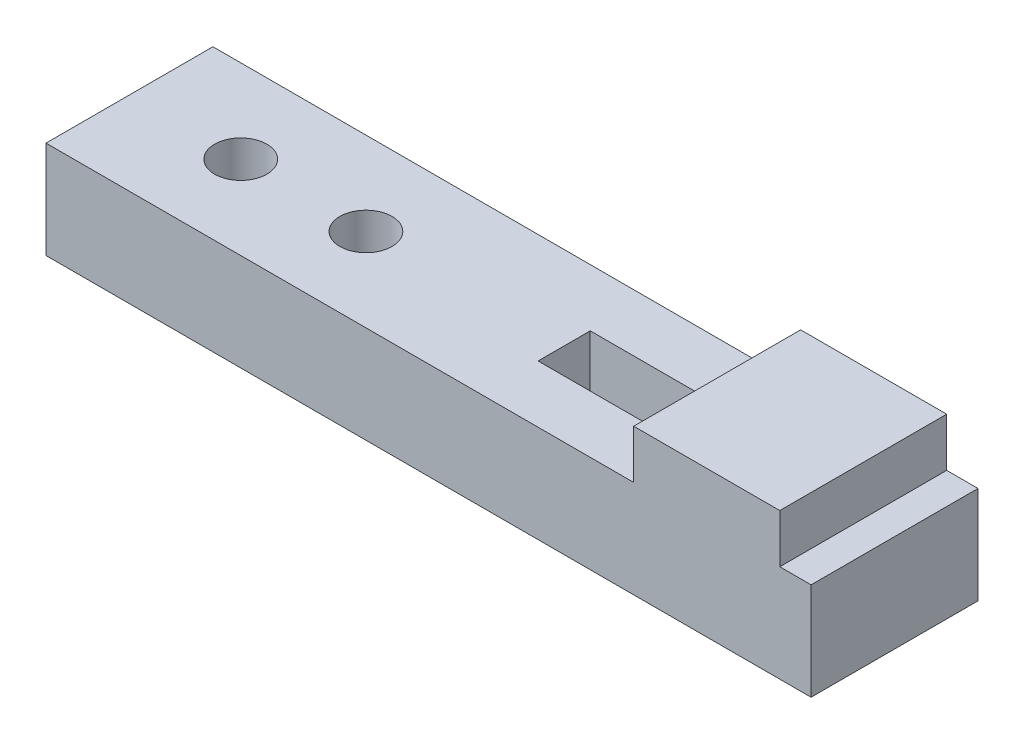
ISO-10303-21;
HEADER;
FILE_DESCRIPTION(('STEP AP214'),'2;1');
FILE_NAME('part.step','',(''),(''),'','','');
FILE_SCHEMA(('AUTOMOTIVE_DESIGN { 1 0 10303 214 1 1 1 1 }'));
ENDSEC;
DATA;
#1=APPLICATION_CONTEXT('core data for automotive mechanical design processes');
#2=APPLICATION_PROTOCOL_DEFINITION('international standard','automotive_design',2000,#1);
#3=PRODUCT_CONTEXT('',#1,'mechanical');
#4=PRODUCT('Part','Part','',(#3));
#5=PRODUCT_RELATED_PRODUCT_CATEGORY('part','',(#4));
#6=PRODUCT_DEFINITION_FORMATION('','',#4);
#7=PRODUCT_DEFINITION_CONTEXT('part definition',#1,'design');
#8=PRODUCT_DEFINITION('design','',#6,#7);
#9=PRODUCT_DEFINITION_SHAPE('','',#8);
#10=(LENGTH_UNIT() NAMED_UNIT(*) SI_UNIT(.MILLI.,.METRE.));
#11=(NAMED_UNIT(*) PLANE_ANGLE_UNIT() SI_UNIT($,.RADIAN.));
#12=(NAMED_UNIT(*) SI_UNIT($,.STERADIAN.) SOLID_ANGLE_UNIT());
#13=UNCERTAINTY_MEASURE_WITH_UNIT(LENGTH_MEASURE(1.E-05),#10,'distance_accuracy_value','');
#14=(GEOMETRIC_REPRESENTATION_CONTEXT(3) GLOBAL_UNCERTAINTY_ASSIGNED_CONTEXT((#13)) GLOBAL_UNIT_ASSIGNED_CONTEXT((#10,
#11,#12)) REPRESENTATION_CONTEXT('',''));
#15=CARTESIAN_POINT('',(0.,0.,0.));
#16=DIRECTION('',(0.,0.,1.));
#17=DIRECTION('',(1.,0.,0.));
#18=AXIS2_PLACEMENT_3D('',#15,#16,#17);
#19=CARTESIAN_POINT('',(0.,28.,0.));
#20=DIRECTION('',(0.,-1.,0.));
#21=DIRECTION('',(0.,0.,-1.));
#22=AXIS2_PLACEMENT_3D('',#19,#20,#21);
#23=PLANE('',#22);
#24=DIRECTION('',(0.,0.,-1.));
#25=VECTOR('',#24,1.);
#26=CARTESIAN_POINT('',(101.,28.,0.));
#27=LINE('',#26,#25);
#28=CARTESIAN_POINT('',(101.,28.,24.));
#29=VERTEX_POINT('',#28);
#30=CARTESIAN_POINT('',(101.,28.,-24.));
#31=VERTEX_POINT('',#30);
#32=EDGE_CURVE('E160',#29,#31,#27,.T.);
#33=ORIENTED_EDGE('',*,*,#32,.F.);
#34=DIRECTION('',(1.,0.,0.));
#35=VECTOR('',#34,1.);
#36=CARTESIAN_POINT('',(-110.,28.,24.));
#37=LINE('',#36,#35);
#38=CARTESIAN_POINT('',(110.,28.,24.));
#39=VERTEX_POINT('',#38);
#40=EDGE_CURVE('E63',#29,#39,#37,.T.);
#41=ORIENTED_EDGE('',*,*,#40,.T.);
#42=DIRECTION('',(0.,0.,-1.));
#43=VECTOR('',#42,1.);
#44=CARTESIAN_POINT('',(110.,28.,24.));
#45=LINE('',#44,#43);
#46=CARTESIAN_POINT('',(110.,28.,-24.));
#47=VERTEX_POINT('',#46);
#48=EDGE_CURVE('E204',#39,#47,#45,.T.);
#49=ORIENTED_EDGE('',*,*,#48,.T.);
#50=DIRECTION('',(-1.,0.,0.));
#51=VECTOR('',#50,1.);
#52=CARTESIAN_POINT('',(-110.,28.,-24.));
#53=LINE('',#52,#51);
#54=EDGE_CURVE('E93',#47,#31,#53,.T.);
#55=ORIENTED_EDGE('',*,*,#54,.T.);
#56=EDGE_LOOP('',(#33,#41,#49,#55));
#57=FACE_BOUND('',#56,.T.);
#58=ADVANCED_FACE('F39',(#57),#23,.F.);
#59=CARTESIAN_POINT('',(-78.,28.,0.));
#60=DIRECTION('',(0.,1.,0.));
#61=DIRECTION('',(0.,0.,1.));
#62=AXIS2_PLACEMENT_3D('',#59,#60,#61);
#63=CIRCLE('',#62,7.5);
#64=CARTESIAN_POINT('',(-78.,28.,7.5));
#65=VERTEX_POINT('',#64);
#66=EDGE_CURVE('E198',#65,#65,#63,.T.);
#67=ORIENTED_EDGE('',*,*,#66,.F.);
#68=EDGE_LOOP('',(#67));
#69=FACE_BOUND('',#68,.T.);
#70=CARTESIAN_POINT('',(-42.,28.,0.));
#71=DIRECTION('',(0.,1.,0.));
#72=DIRECTION('',(0.,0.,1.));
#73=AXIS2_PLACEMENT_3D('',#70,#71,#72);
#74=CIRCLE('',#73,7.5);
#75=CARTESIAN_POINT('',(-42.,28.,7.5));
#76=VERTEX_POINT('',#75);
#77=EDGE_CURVE('E192',#76,#76,#74,.T.);
#78=ORIENTED_EDGE('',*,*,#77,.F.);
#79=EDGE_LOOP('',(#78));
#80=FACE_BOUND('',#79,.T.);
#81=DIRECTION('',(0.,0.,1.));
#82=VECTOR('',#81,1.);
#83=CARTESIAN_POINT('',(59.,28.,0.));
#84=LINE('',#83,#82);
#85=CARTESIAN_POINT('',(59.,28.,-24.));
#86=VERTEX_POINT('',#85);
#87=CARTESIAN_POINT('',(59.,28.,-7.5));
#88=VERTEX_POINT('',#87);
#89=EDGE_CURVE('E165',#86,#88,#84,.T.);
#90=ORIENTED_EDGE('',*,*,#89,.F.);
#91=CARTESIAN_POINT('',(-110.,28.,-24.));
#92=VERTEX_POINT('',#91);
#93=EDGE_CURVE('E206',#86,#92,#53,.T.);
#94=ORIENTED_EDGE('',*,*,#93,.T.);
#95=DIRECTION('',(0.,0.,1.));
#96=VECTOR('',#95,1.);
#97=CARTESIAN_POINT('',(-110.,28.,24.));
#98=LINE('',#97,#96);
#99=CARTESIAN_POINT('',(-110.,28.,24.));
#100=VERTEX_POINT('',#99);
#101=EDGE_CURVE('E208',#92,#100,#98,.T.);
#102=ORIENTED_EDGE('',*,*,#101,.T.);
#103=CARTESIAN_POINT('',(59.,28.,24.));
#104=VERTEX_POINT('',#103);
#105=EDGE_CURVE('E210',#100,#104,#37,.T.);
#106=ORIENTED_EDGE('',*,*,#105,.T.);
#107=CARTESIAN_POINT('',(59.,28.,7.5));
#108=VERTEX_POINT('',#107);
#109=EDGE_CURVE('E161',#108,#104,#84,.T.);
#110=ORIENTED_EDGE('',*,*,#109,.F.);
#111=DIRECTION('',(1.,0.,0.));
#112=VECTOR('',#111,1.);
#113=CARTESIAN_POINT('',(15.,28.,7.5));
#114=LINE('',#113,#112);
#115=CARTESIAN_POINT('',(15.,28.,7.5));
#116=VERTEX_POINT('',#115);
#117=EDGE_CURVE('E179',#116,#108,#114,.T.);
#118=ORIENTED_EDGE('',*,*,#117,.F.);
#119=DIRECTION('',(0.,0.,1.));
#120=VECTOR('',#119,1.);
#121=CARTESIAN_POINT('',(15.,28.,7.5));
#122=LINE('',#121,#120);
#123=CARTESIAN_POINT('',(15.,28.,-7.5));
#124=VERTEX_POINT('',#123);
#125=EDGE_CURVE('E176',#124,#116,#122,.T.);
#126=ORIENTED_EDGE('',*,*,#125,.F.);
#127=DIRECTION('',(-1.,0.,0.));
#128=VECTOR('',#127,1.);
#129=CARTESIAN_POINT('',(15.,28.,-7.5));
#130=LINE('',#129,#128);
#131=EDGE_CURVE('E174',#88,#124,#130,.T.);
#132=ORIENTED_EDGE('',*,*,#131,.F.);
#133=EDGE_LOOP('',(#90,#94,#102,#106,#110,#118,#126,#132));
#134=FACE_BOUND('',#133,.T.);
#135=ADVANCED_FACE('F246',(#69,#80,#134),#23,.F.);
#136=CARTESIAN_POINT('',(15.,28.,-7.5));
#137=DIRECTION('',(0.,0.,1.));
#138=DIRECTION('',(1.,0.,0.));
#139=AXIS2_PLACEMENT_3D('',#136,#137,#138);
#140=PLANE('',#139);
#141=DIRECTION('',(-1.,0.,0.));
#142=VECTOR('',#141,1.);
#143=CARTESIAN_POINT('',(15.,0.,-7.5));
#144=LINE('',#143,#142);
#145=CARTESIAN_POINT('',(59.,0.,-7.5));
#146=VERTEX_POINT('',#145);
#147=CARTESIAN_POINT('',(15.,0.,-7.5));
#148=VERTEX_POINT('',#147);
#149=EDGE_CURVE('E173',#146,#148,#144,.T.);
#150=ORIENTED_EDGE('',*,*,#149,.F.);
#151=DIRECTION('',(0.,1.,0.));
#152=VECTOR('',#151,1.);
#153=CARTESIAN_POINT('',(59.,28.,-7.5));
#154=LINE('',#153,#152);
#155=EDGE_CURVE('E163',#146,#88,#154,.T.);
#156=ORIENTED_EDGE('',*,*,#155,.T.);
#157=ORIENTED_EDGE('',*,*,#131,.T.);
#158=DIRECTION('',(0.,-1.,0.));
#159=VECTOR('',#158,1.);
#160=CARTESIAN_POINT('',(15.,28.,-7.5));
#161=LINE('',#160,#159);
#162=EDGE_CURVE('E188',#124,#148,#161,.T.);
#163=ORIENTED_EDGE('',*,*,#162,.T.);
#164=EDGE_LOOP('',(#150,#156,#157,#163));
#165=FACE_BOUND('',#164,.T.);
#166=ADVANCED_FACE('F255',(#165),#140,.T.);
#167=CARTESIAN_POINT('',(15.,28.,7.5));
#168=DIRECTION('',(0.,0.,-1.));
#169=DIRECTION('',(-1.,0.,0.));
#170=AXIS2_PLACEMENT_3D('',#167,#168,#169);
#171=PLANE('',#170);
#172=ORIENTED_EDGE('',*,*,#117,.T.);
#173=DIRECTION('',(0.,-1.,0.));
#174=VECTOR('',#173,1.);
#175=CARTESIAN_POINT('',(59.,28.,7.5));
#176=LINE('',#175,#174);
#177=CARTESIAN_POINT('',(59.,0.,7.5));
#178=VERTEX_POINT('',#177);
#179=EDGE_CURVE('E11',#108,#178,#176,.T.);
#180=ORIENTED_EDGE('',*,*,#179,.T.);
#181=DIRECTION('',(1.,0.,0.));
#182=VECTOR('',#181,1.);
#183=CARTESIAN_POINT('',(15.,0.,7.5));
#184=LINE('',#183,#182);
#185=CARTESIAN_POINT('',(15.,0.,7.5));
#186=VERTEX_POINT('',#185);
#187=EDGE_CURVE('E177',#186,#178,#184,.T.);
#188=ORIENTED_EDGE('',*,*,#187,.F.);
#189=DIRECTION('',(0.,-1.,0.));
#190=VECTOR('',#189,1.);
#191=CARTESIAN_POINT('',(15.,28.,7.5));
#192=LINE('',#191,#190);
#193=EDGE_CURVE('E54',#116,#186,#192,.T.);
#194=ORIENTED_EDGE('',*,*,#193,.F.);
#195=EDGE_LOOP('',(#172,#180,#188,#194));
#196=FACE_BOUND('',#195,.T.);
#197=ADVANCED_FACE('F276',(#196),#171,.T.);
#198=CARTESIAN_POINT('',(0.,0.,0.));
#199=DIRECTION('',(0.,-1.,0.));
#200=DIRECTION('',(0.,0.,-1.));
#201=AXIS2_PLACEMENT_3D('',#198,#199,#200);
#202=PLANE('',#201);
#203=DIRECTION('',(0.,0.,1.));
#204=VECTOR('',#203,1.);
#205=CARTESIAN_POINT('',(59.,0.,24.));
#206=LINE('',#205,#204);
#207=EDGE_CURVE('E157',#146,#178,#206,.T.);
#208=ORIENTED_EDGE('',*,*,#207,.F.);
#209=ORIENTED_EDGE('',*,*,#149,.T.);
#210=DIRECTION('',(0.,0.,1.));
#211=VECTOR('',#210,1.);
#212=CARTESIAN_POINT('',(15.,0.,7.5));
#213=LINE('',#212,#211);
#214=EDGE_CURVE('E182',#148,#186,#213,.T.);
#215=ORIENTED_EDGE('',*,*,#214,.T.);
#216=ORIENTED_EDGE('',*,*,#187,.T.);
#217=EDGE_LOOP('',(#208,#209,#215,#216));
#218=FACE_BOUND('',#217,.T.);
#219=DIRECTION('',(0.,0.,1.));
#220=VECTOR('',#219,1.);
#221=CARTESIAN_POINT('',(-110.,0.,24.));
#222=LINE('',#221,#220);
#223=CARTESIAN_POINT('',(-110.,0.,-24.));
#224=VERTEX_POINT('',#223);
#225=CARTESIAN_POINT('',(-110.,0.,24.));
#226=VERTEX_POINT('',#225);
#227=EDGE_CURVE('E218',#224,#226,#222,.T.);
#228=ORIENTED_EDGE('',*,*,#227,.F.);
#229=DIRECTION('',(-1.,0.,0.));
#230=VECTOR('',#229,1.);
#231=CARTESIAN_POINT('',(-110.,0.,-24.));
#232=LINE('',#231,#230);
#233=CARTESIAN_POINT('',(110.,0.,-24.));
#234=VERTEX_POINT('',#233);
#235=EDGE_CURVE('E216',#234,#224,#232,.T.);
#236=ORIENTED_EDGE('',*,*,#235,.F.);
#237=DIRECTION('',(0.,0.,-1.));
#238=VECTOR('',#237,1.);
#239=CARTESIAN_POINT('',(110.,0.,24.));
#240=LINE('',#239,#238);
#241=CARTESIAN_POINT('',(110.,0.,24.));
#242=VERTEX_POINT('',#241);
#243=EDGE_CURVE('E201',#242,#234,#240,.T.);
#244=ORIENTED_EDGE('',*,*,#243,.F.);
#245=DIRECTION('',(1.,0.,0.));
#246=VECTOR('',#245,1.);
#247=CARTESIAN_POINT('',(-110.,0.,24.));
#248=LINE('',#247,#246);
#249=EDGE_CURVE('E85',#226,#242,#248,.T.);
#250=ORIENTED_EDGE('',*,*,#249,.F.);
#251=EDGE_LOOP('',(#228,#236,#244,#250));
#252=FACE_BOUND('',#251,.T.);
#253=CARTESIAN_POINT('',(-78.,0.,0.));
#254=DIRECTION('',(0.,1.,0.));
#255=DIRECTION('',(0.,0.,1.));
#256=AXIS2_PLACEMENT_3D('',#253,#254,#255);
#257=CIRCLE('',#256,7.5);
#258=CARTESIAN_POINT('',(-78.,0.,7.5));
#259=VERTEX_POINT('',#258);
#260=EDGE_CURVE('E195',#259,#259,#257,.T.);
#261=ORIENTED_EDGE('',*,*,#260,.T.);
#262=EDGE_LOOP('',(#261));
#263=FACE_BOUND('',#262,.T.);
#264=CARTESIAN_POINT('',(-42.,0.,0.));
#265=DIRECTION('',(0.,1.,0.));
#266=DIRECTION('',(0.,0.,1.));
#267=AXIS2_PLACEMENT_3D('',#264,#265,#266);
#268=CIRCLE('',#267,7.5);
#269=CARTESIAN_POINT('',(-42.,0.,7.5));
#270=VERTEX_POINT('',#269);
#271=EDGE_CURVE('E191',#270,#270,#268,.T.);
#272=ORIENTED_EDGE('',*,*,#271,.T.);
#273=EDGE_LOOP('',(#272));
#274=FACE_BOUND('',#273,.T.);
#275=ADVANCED_FACE('F233',(#218,#252,#263,#274),#202,.T.);
#276=CARTESIAN_POINT('',(110.,28.,24.));
#277=DIRECTION('',(-1.,0.,0.));
#278=DIRECTION('',(0.,0.,1.));
#279=AXIS2_PLACEMENT_3D('',#276,#277,#278);
#280=PLANE('',#279);
#281=ORIENTED_EDGE('',*,*,#243,.T.);
#282=DIRECTION('',(0.,-1.,0.));
#283=VECTOR('',#282,1.);
#284=CARTESIAN_POINT('',(110.,28.,-24.));
#285=LINE('',#284,#283);
#286=EDGE_CURVE('E47',#47,#234,#285,.T.);
#287=ORIENTED_EDGE('',*,*,#286,.F.);
#288=ORIENTED_EDGE('',*,*,#48,.F.);
#289=DIRECTION('',(0.,-1.,0.));
#290=VECTOR('',#289,1.);
#291=CARTESIAN_POINT('',(110.,28.,24.));
#292=LINE('',#291,#290);
#293=EDGE_CURVE('E213',#39,#242,#292,.T.);
#294=ORIENTED_EDGE('',*,*,#293,.T.);
#295=EDGE_LOOP('',(#281,#287,#288,#294));
#296=FACE_BOUND('',#295,.T.);
#297=ADVANCED_FACE('F41',(#296),#280,.F.);
#298=CARTESIAN_POINT('',(-110.,28.,-24.));
#299=DIRECTION('',(0.,0.,1.));
#300=DIRECTION('',(1.,0.,0.));
#301=AXIS2_PLACEMENT_3D('',#298,#299,#300);
#302=PLANE('',#301);
#303=ORIENTED_EDGE('',*,*,#93,.F.);
#304=DIRECTION('',(0.,-1.,0.));
#305=VECTOR('',#304,1.);
#306=CARTESIAN_POINT('',(59.,42.,-24.));
#307=LINE('',#306,#305);
#308=CARTESIAN_POINT('',(59.,42.,-24.));
#309=VERTEX_POINT('',#308);
#310=EDGE_CURVE('E145',#309,#86,#307,.T.);
#311=ORIENTED_EDGE('',*,*,#310,.F.);
#312=DIRECTION('',(-1.,0.,0.));
#313=VECTOR('',#312,1.);
#314=CARTESIAN_POINT('',(59.,42.,-24.));
#315=LINE('',#314,#313);
#316=CARTESIAN_POINT('',(101.,42.,-24.));
#317=VERTEX_POINT('',#316);
#318=EDGE_CURVE('E139',#317,#309,#315,.T.);
#319=ORIENTED_EDGE('',*,*,#318,.F.);
#320=DIRECTION('',(0.,-1.,0.));
#321=VECTOR('',#320,1.);
#322=CARTESIAN_POINT('',(101.,42.,-24.));
#323=LINE('',#322,#321);
#324=EDGE_CURVE('E144',#317,#31,#323,.T.);
#325=ORIENTED_EDGE('',*,*,#324,.T.);
#326=ORIENTED_EDGE('',*,*,#54,.F.);
#327=ORIENTED_EDGE('',*,*,#286,.T.);
#328=ORIENTED_EDGE('',*,*,#235,.T.);
#329=DIRECTION('',(0.,-1.,0.));
#330=VECTOR('',#329,1.);
#331=CARTESIAN_POINT('',(-110.,28.,-24.));
#332=LINE('',#331,#330);
#333=EDGE_CURVE('E224',#92,#224,#332,.T.);
#334=ORIENTED_EDGE('',*,*,#333,.F.);
#335=EDGE_LOOP('',(#303,#311,#319,#325,#326,#327,#328,#334));
#336=FACE_BOUND('',#335,.T.);
#337=ADVANCED_FACE('F142',(#336),#302,.F.);
#338=CARTESIAN_POINT('',(-110.,28.,24.));
#339=DIRECTION('',(1.,0.,0.));
#340=DIRECTION('',(0.,0.,-1.));
#341=AXIS2_PLACEMENT_3D('',#338,#339,#340);
#342=PLANE('',#341);
#343=ORIENTED_EDGE('',*,*,#227,.T.);
#344=DIRECTION('',(0.,-1.,0.));
#345=VECTOR('',#344,1.);
#346=CARTESIAN_POINT('',(-110.,28.,24.));
#347=LINE('',#346,#345);
#348=EDGE_CURVE('E222',#100,#226,#347,.T.);
#349=ORIENTED_EDGE('',*,*,#348,.F.);
#350=ORIENTED_EDGE('',*,*,#101,.F.);
#351=ORIENTED_EDGE('',*,*,#333,.T.);
#352=EDGE_LOOP('',(#343,#349,#350,#351));
#353=FACE_BOUND('',#352,.T.);
#354=ADVANCED_FACE('F237',(#353),#342,.F.);
#355=CARTESIAN_POINT('',(-110.,28.,24.));
#356=DIRECTION('',(0.,0.,-1.));
#357=DIRECTION('',(-1.,0.,0.));
#358=AXIS2_PLACEMENT_3D('',#355,#356,#357);
#359=PLANE('',#358);
#360=ORIENTED_EDGE('',*,*,#249,.T.);
#361=ORIENTED_EDGE('',*,*,#293,.F.);
#362=ORIENTED_EDGE('',*,*,#40,.F.);
#363=DIRECTION('',(0.,-1.,0.));
#364=VECTOR('',#363,1.);
#365=CARTESIAN_POINT('',(101.,42.,24.));
#366=LINE('',#365,#364);
#367=CARTESIAN_POINT('',(101.,42.,24.));
#368=VERTEX_POINT('',#367);
#369=EDGE_CURVE('E263',#368,#29,#366,.T.);
#370=ORIENTED_EDGE('',*,*,#369,.F.);
#371=DIRECTION('',(1.,0.,0.));
#372=VECTOR('',#371,1.);
#373=CARTESIAN_POINT('',(59.,42.,24.));
#374=LINE('',#373,#372);
#375=CARTESIAN_POINT('',(59.,42.,24.));
#376=VERTEX_POINT('',#375);
#377=EDGE_CURVE('E154',#376,#368,#374,.T.);
#378=ORIENTED_EDGE('',*,*,#377,.F.);
#379=DIRECTION('',(0.,-1.,0.));
#380=VECTOR('',#379,1.);
#381=CARTESIAN_POINT('',(59.,42.,24.));
#382=LINE('',#381,#380);
#383=EDGE_CURVE('E166',#376,#104,#382,.T.);
#384=ORIENTED_EDGE('',*,*,#383,.T.);
#385=ORIENTED_EDGE('',*,*,#105,.F.);
#386=ORIENTED_EDGE('',*,*,#348,.T.);
#387=EDGE_LOOP('',(#360,#361,#362,#370,#378,#384,#385,#386));
#388=FACE_BOUND('',#387,.T.);
#389=ADVANCED_FACE('F240',(#388),#359,.F.);
#390=CARTESIAN_POINT('',(-78.,28.,0.));
#391=DIRECTION('',(0.,-1.,0.));
#392=DIRECTION('',(0.,0.,-1.));
#393=AXIS2_PLACEMENT_3D('',#390,#391,#392);
#394=CYLINDRICAL_SURFACE('',#393,7.5);
#395=ORIENTED_EDGE('',*,*,#66,.T.);
#396=EDGE_LOOP('',(#395));
#397=FACE_BOUND('',#396,.T.);
#398=ORIENTED_EDGE('',*,*,#260,.F.);
#399=EDGE_LOOP('',(#398));
#400=FACE_BOUND('',#399,.T.);
#401=ADVANCED_FACE('F272',(#397,#400),#394,.F.);
#402=CARTESIAN_POINT('',(-42.,28.,0.));
#403=DIRECTION('',(0.,-1.,0.));
#404=DIRECTION('',(0.,0.,-1.));
#405=AXIS2_PLACEMENT_3D('',#402,#403,#404);
#406=CYLINDRICAL_SURFACE('',#405,7.5);
#407=ORIENTED_EDGE('',*,*,#77,.T.);
#408=EDGE_LOOP('',(#407));
#409=FACE_BOUND('',#408,.T.);
#410=ORIENTED_EDGE('',*,*,#271,.F.);
#411=EDGE_LOOP('',(#410));
#412=FACE_BOUND('',#411,.T.);
#413=ADVANCED_FACE('F322',(#409,#412),#406,.F.);
#414=CARTESIAN_POINT('',(15.,28.,7.5));
#415=DIRECTION('',(1.,0.,0.));
#416=DIRECTION('',(0.,0.,-1.));
#417=AXIS2_PLACEMENT_3D('',#414,#415,#416);
#418=PLANE('',#417);
#419=ORIENTED_EDGE('',*,*,#214,.F.);
#420=ORIENTED_EDGE('',*,*,#162,.F.);
#421=ORIENTED_EDGE('',*,*,#125,.T.);
#422=ORIENTED_EDGE('',*,*,#193,.T.);
#423=EDGE_LOOP('',(#419,#420,#421,#422));
#424=FACE_BOUND('',#423,.T.);
#425=ADVANCED_FACE('F317',(#424),#418,.T.);
#426=CARTESIAN_POINT('',(101.,42.,24.));
#427=DIRECTION('',(-1.,0.,0.));
#428=DIRECTION('',(0.,0.,1.));
#429=AXIS2_PLACEMENT_3D('',#426,#427,#428);
#430=PLANE('',#429);
#431=ORIENTED_EDGE('',*,*,#369,.T.);
#432=ORIENTED_EDGE('',*,*,#32,.T.);
#433=ORIENTED_EDGE('',*,*,#324,.F.);
#434=DIRECTION('',(0.,0.,-1.));
#435=VECTOR('',#434,1.);
#436=CARTESIAN_POINT('',(101.,42.,24.));
#437=LINE('',#436,#435);
#438=EDGE_CURVE('E149',#368,#317,#437,.T.);
#439=ORIENTED_EDGE('',*,*,#438,.F.);
#440=EDGE_LOOP('',(#431,#432,#433,#439));
#441=FACE_BOUND('',#440,.T.);
#442=ADVANCED_FACE('F159',(#441),#430,.F.);
#443=CARTESIAN_POINT('',(59.,42.,24.));
#444=DIRECTION('',(1.,0.,0.));
#445=DIRECTION('',(0.,0.,-1.));
#446=AXIS2_PLACEMENT_3D('',#443,#444,#445);
#447=PLANE('',#446);
#448=ORIENTED_EDGE('',*,*,#310,.T.);
#449=ORIENTED_EDGE('',*,*,#89,.T.);
#450=ORIENTED_EDGE('',*,*,#155,.F.);
#451=ORIENTED_EDGE('',*,*,#207,.T.);
#452=ORIENTED_EDGE('',*,*,#179,.F.);
#453=ORIENTED_EDGE('',*,*,#109,.T.);
#454=ORIENTED_EDGE('',*,*,#383,.F.);
#455=DIRECTION('',(0.,0.,1.));
#456=VECTOR('',#455,1.);
#457=CARTESIAN_POINT('',(59.,42.,24.));
#458=LINE('',#457,#456);
#459=EDGE_CURVE('E148',#309,#376,#458,.T.);
#460=ORIENTED_EDGE('',*,*,#459,.F.);
#461=EDGE_LOOP('',(#448,#449,#450,#451,#452,#453,#454,#460));
#462=FACE_BOUND('',#461,.T.);
#463=ADVANCED_FACE('F251',(#462),#447,.F.);
#464=CARTESIAN_POINT('',(0.,42.,0.));
#465=DIRECTION('',(0.,-1.,0.));
#466=DIRECTION('',(0.,0.,-1.));
#467=AXIS2_PLACEMENT_3D('',#464,#465,#466);
#468=PLANE('',#467);
#469=ORIENTED_EDGE('',*,*,#438,.T.);
#470=ORIENTED_EDGE('',*,*,#318,.T.);
#471=ORIENTED_EDGE('',*,*,#459,.T.);
#472=ORIENTED_EDGE('',*,*,#377,.T.);
#473=EDGE_LOOP('',(#469,#470,#471,#472));
#474=FACE_BOUND('',#473,.T.);
#475=ADVANCED_FACE('F152',(#474),#468,.F.);
#476=CLOSED_SHELL('',(#58,#135,#166,#197,#275,#297,#337,#354,#389,#401,#413,#425,#442,#463,#475));
#477=MANIFOLD_SOLID_BREP('B2',#476);
#478=ADVANCED_BREP_SHAPE_REPRESENTATION('',(#18,#477),#14);
#479=SHAPE_DEFINITION_REPRESENTATION(#9,#478);
ENDSEC;
END-ISO-10303-21;
